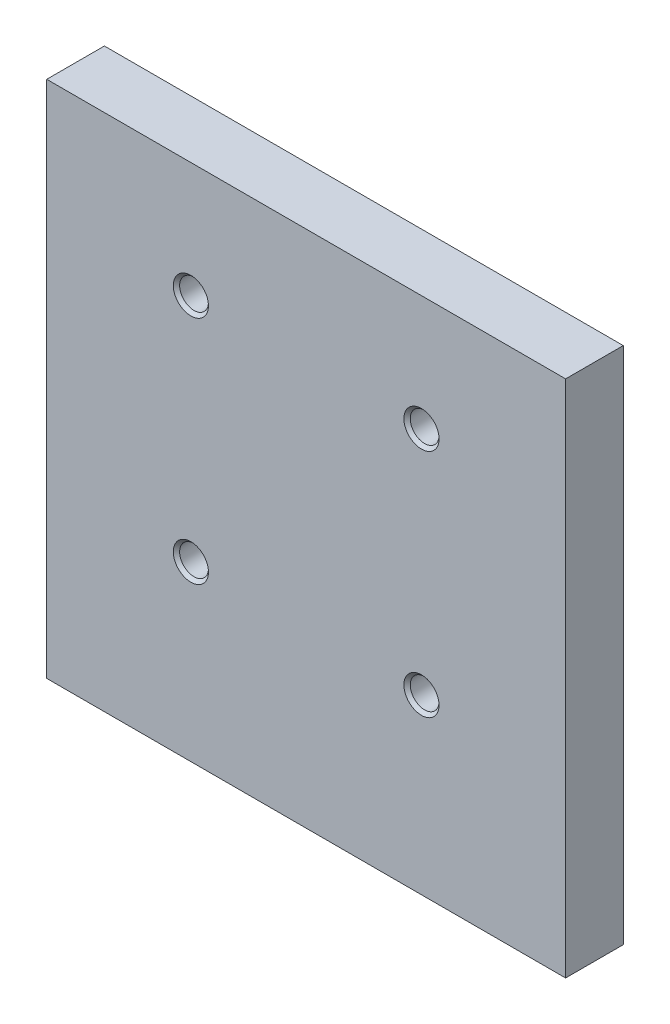
ISO-10303-21;
HEADER;
FILE_DESCRIPTION(('STEP AP214'),'2;1');
FILE_NAME('part.step','',(''),(''),'','','');
FILE_SCHEMA(('AUTOMOTIVE_DESIGN { 1 0 10303 214 1 1 1 1 }'));
ENDSEC;
DATA;
#1=APPLICATION_CONTEXT('core data for automotive mechanical design processes');
#2=APPLICATION_PROTOCOL_DEFINITION('international standard','automotive_design',2000,#1);
#3=PRODUCT_CONTEXT('',#1,'mechanical');
#4=PRODUCT('Part','Part','',(#3));
#5=PRODUCT_RELATED_PRODUCT_CATEGORY('part','',(#4));
#6=PRODUCT_DEFINITION_FORMATION('','',#4);
#7=PRODUCT_DEFINITION_CONTEXT('part definition',#1,'design');
#8=PRODUCT_DEFINITION('design','',#6,#7);
#9=PRODUCT_DEFINITION_SHAPE('','',#8);
#10=(LENGTH_UNIT() NAMED_UNIT(*) SI_UNIT(.MILLI.,.METRE.));
#11=(NAMED_UNIT(*) PLANE_ANGLE_UNIT() SI_UNIT($,.RADIAN.));
#12=(NAMED_UNIT(*) SI_UNIT($,.STERADIAN.) SOLID_ANGLE_UNIT());
#13=UNCERTAINTY_MEASURE_WITH_UNIT(LENGTH_MEASURE(1.E-05),#10,'distance_accuracy_value','');
#14=(GEOMETRIC_REPRESENTATION_CONTEXT(3) GLOBAL_UNCERTAINTY_ASSIGNED_CONTEXT((#13)) GLOBAL_UNIT_ASSIGNED_CONTEXT((#10,
#11,#12)) REPRESENTATION_CONTEXT('',''));
#15=CARTESIAN_POINT('',(0.,0.,0.));
#16=DIRECTION('',(0.,0.,1.));
#17=DIRECTION('',(1.,0.,0.));
#18=AXIS2_PLACEMENT_3D('',#15,#16,#17);
#19=CARTESIAN_POINT('',(0.,0.,5.));
#20=DIRECTION('',(1.,0.,0.));
#21=DIRECTION('',(0.,0.,-1.));
#22=AXIS2_PLACEMENT_3D('',#19,#20,#21);
#23=PLANE('',#22);
#24=DIRECTION('',(0.,-1.,0.));
#25=VECTOR('',#24,1.);
#26=CARTESIAN_POINT('',(0.,0.,0.));
#27=LINE('',#26,#25);
#28=CARTESIAN_POINT('',(0.,45.,0.));
#29=VERTEX_POINT('',#28);
#30=CARTESIAN_POINT('',(0.,0.,0.));
#31=VERTEX_POINT('',#30);
#32=EDGE_CURVE('E120',#29,#31,#27,.T.);
#33=ORIENTED_EDGE('',*,*,#32,.T.);
#34=DIRECTION('',(0.,0.,-1.));
#35=VECTOR('',#34,1.);
#36=CARTESIAN_POINT('',(0.,0.,5.));
#37=LINE('',#36,#35);
#38=CARTESIAN_POINT('',(0.,0.,5.));
#39=VERTEX_POINT('',#38);
#40=EDGE_CURVE('E11',#39,#31,#37,.T.);
#41=ORIENTED_EDGE('',*,*,#40,.F.);
#42=DIRECTION('',(0.,-1.,0.));
#43=VECTOR('',#42,1.);
#44=CARTESIAN_POINT('',(0.,0.,5.));
#45=LINE('',#44,#43);
#46=CARTESIAN_POINT('',(0.,45.,5.));
#47=VERTEX_POINT('',#46);
#48=EDGE_CURVE('E103',#47,#39,#45,.T.);
#49=ORIENTED_EDGE('',*,*,#48,.F.);
#50=DIRECTION('',(0.,0.,-1.));
#51=VECTOR('',#50,1.);
#52=CARTESIAN_POINT('',(0.,45.,5.));
#53=LINE('',#52,#51);
#54=EDGE_CURVE('E116',#47,#29,#53,.T.);
#55=ORIENTED_EDGE('',*,*,#54,.T.);
#56=EDGE_LOOP('',(#33,#41,#49,#55));
#57=FACE_BOUND('',#56,.T.);
#58=ADVANCED_FACE('F51',(#57),#23,.F.);
#59=CARTESIAN_POINT('',(0.,0.,5.));
#60=DIRECTION('',(0.,1.,0.));
#61=DIRECTION('',(0.,0.,1.));
#62=AXIS2_PLACEMENT_3D('',#59,#60,#61);
#63=PLANE('',#62);
#64=DIRECTION('',(1.,0.,0.));
#65=VECTOR('',#64,1.);
#66=CARTESIAN_POINT('',(0.,0.,0.));
#67=LINE('',#66,#65);
#68=CARTESIAN_POINT('',(45.,0.,0.));
#69=VERTEX_POINT('',#68);
#70=EDGE_CURVE('E108',#31,#69,#67,.T.);
#71=ORIENTED_EDGE('',*,*,#70,.T.);
#72=DIRECTION('',(0.,0.,-1.));
#73=VECTOR('',#72,1.);
#74=CARTESIAN_POINT('',(45.,0.,5.));
#75=LINE('',#74,#73);
#76=CARTESIAN_POINT('',(45.,0.,5.));
#77=VERTEX_POINT('',#76);
#78=EDGE_CURVE('E60',#77,#69,#75,.T.);
#79=ORIENTED_EDGE('',*,*,#78,.F.);
#80=DIRECTION('',(1.,0.,0.));
#81=VECTOR('',#80,1.);
#82=CARTESIAN_POINT('',(0.,0.,5.));
#83=LINE('',#82,#81);
#84=EDGE_CURVE('E98',#39,#77,#83,.T.);
#85=ORIENTED_EDGE('',*,*,#84,.F.);
#86=ORIENTED_EDGE('',*,*,#40,.T.);
#87=EDGE_LOOP('',(#71,#79,#85,#86));
#88=FACE_BOUND('',#87,.T.);
#89=ADVANCED_FACE('F107',(#88),#63,.F.);
#90=CARTESIAN_POINT('',(45.,0.,5.));
#91=DIRECTION('',(-1.,0.,0.));
#92=DIRECTION('',(0.,0.,1.));
#93=AXIS2_PLACEMENT_3D('',#90,#91,#92);
#94=PLANE('',#93);
#95=DIRECTION('',(0.,1.,0.));
#96=VECTOR('',#95,1.);
#97=CARTESIAN_POINT('',(45.,0.,0.));
#98=LINE('',#97,#96);
#99=CARTESIAN_POINT('',(45.,45.,0.));
#100=VERTEX_POINT('',#99);
#101=EDGE_CURVE('E85',#69,#100,#98,.T.);
#102=ORIENTED_EDGE('',*,*,#101,.T.);
#103=DIRECTION('',(0.,0.,-1.));
#104=VECTOR('',#103,1.);
#105=CARTESIAN_POINT('',(45.,45.,5.));
#106=LINE('',#105,#104);
#107=CARTESIAN_POINT('',(45.,45.,5.));
#108=VERTEX_POINT('',#107);
#109=EDGE_CURVE('E110',#108,#100,#106,.T.);
#110=ORIENTED_EDGE('',*,*,#109,.F.);
#111=DIRECTION('',(0.,1.,0.));
#112=VECTOR('',#111,1.);
#113=CARTESIAN_POINT('',(45.,0.,5.));
#114=LINE('',#113,#112);
#115=EDGE_CURVE('E101',#77,#108,#114,.T.);
#116=ORIENTED_EDGE('',*,*,#115,.F.);
#117=ORIENTED_EDGE('',*,*,#78,.T.);
#118=EDGE_LOOP('',(#102,#110,#116,#117));
#119=FACE_BOUND('',#118,.T.);
#120=ADVANCED_FACE('F111',(#119),#94,.F.);
#121=CARTESIAN_POINT('',(0.,45.,5.));
#122=DIRECTION('',(0.,-1.,0.));
#123=DIRECTION('',(0.,0.,-1.));
#124=AXIS2_PLACEMENT_3D('',#121,#122,#123);
#125=PLANE('',#124);
#126=DIRECTION('',(-1.,0.,0.));
#127=VECTOR('',#126,1.);
#128=CARTESIAN_POINT('',(0.,45.,0.));
#129=LINE('',#128,#127);
#130=EDGE_CURVE('E91',#100,#29,#129,.T.);
#131=ORIENTED_EDGE('',*,*,#130,.T.);
#132=ORIENTED_EDGE('',*,*,#54,.F.);
#133=DIRECTION('',(-1.,0.,0.));
#134=VECTOR('',#133,1.);
#135=CARTESIAN_POINT('',(0.,45.,5.));
#136=LINE('',#135,#134);
#137=EDGE_CURVE('E68',#108,#47,#136,.T.);
#138=ORIENTED_EDGE('',*,*,#137,.F.);
#139=ORIENTED_EDGE('',*,*,#109,.T.);
#140=EDGE_LOOP('',(#131,#132,#138,#139));
#141=FACE_BOUND('',#140,.T.);
#142=ADVANCED_FACE('F135',(#141),#125,.F.);
#143=CARTESIAN_POINT('',(0.,0.,5.));
#144=DIRECTION('',(0.,0.,-1.));
#145=DIRECTION('',(-1.,0.,0.));
#146=AXIS2_PLACEMENT_3D('',#143,#144,#145);
#147=PLANE('',#146);
#148=CARTESIAN_POINT('',(12.5,35.,5.));
#149=DIRECTION('',(0.,0.,1.));
#150=DIRECTION('',(1.,0.,0.));
#151=AXIS2_PLACEMENT_3D('',#148,#149,#150);
#152=CIRCLE('',#151,1.525);
#153=CARTESIAN_POINT('',(14.025,35.,5.));
#154=VERTEX_POINT('',#153);
#155=EDGE_CURVE('E184',#154,#154,#152,.T.);
#156=ORIENTED_EDGE('',*,*,#155,.F.);
#157=EDGE_LOOP('',(#156));
#158=FACE_BOUND('',#157,.T.);
#159=CARTESIAN_POINT('',(32.5,35.,5.));
#160=DIRECTION('',(0.,0.,1.));
#161=DIRECTION('',(1.,0.,0.));
#162=AXIS2_PLACEMENT_3D('',#159,#160,#161);
#163=CIRCLE('',#162,1.525);
#164=CARTESIAN_POINT('',(34.025,35.,5.));
#165=VERTEX_POINT('',#164);
#166=EDGE_CURVE('E172',#165,#165,#163,.T.);
#167=ORIENTED_EDGE('',*,*,#166,.F.);
#168=EDGE_LOOP('',(#167));
#169=FACE_BOUND('',#168,.T.);
#170=CARTESIAN_POINT('',(32.5,15.,5.));
#171=DIRECTION('',(0.,0.,1.));
#172=DIRECTION('',(1.,0.,0.));
#173=AXIS2_PLACEMENT_3D('',#170,#171,#172);
#174=CIRCLE('',#173,1.525);
#175=CARTESIAN_POINT('',(34.025,15.,5.));
#176=VERTEX_POINT('',#175);
#177=EDGE_CURVE('E161',#176,#176,#174,.T.);
#178=ORIENTED_EDGE('',*,*,#177,.F.);
#179=EDGE_LOOP('',(#178));
#180=FACE_BOUND('',#179,.T.);
#181=CARTESIAN_POINT('',(12.5,15.,5.));
#182=DIRECTION('',(0.,0.,1.));
#183=DIRECTION('',(1.,0.,0.));
#184=AXIS2_PLACEMENT_3D('',#181,#182,#183);
#185=CIRCLE('',#184,1.525);
#186=CARTESIAN_POINT('',(14.025,15.,5.));
#187=VERTEX_POINT('',#186);
#188=EDGE_CURVE('E149',#187,#187,#185,.T.);
#189=ORIENTED_EDGE('',*,*,#188,.F.);
#190=EDGE_LOOP('',(#189));
#191=FACE_BOUND('',#190,.T.);
#192=ORIENTED_EDGE('',*,*,#48,.T.);
#193=ORIENTED_EDGE('',*,*,#84,.T.);
#194=ORIENTED_EDGE('',*,*,#115,.T.);
#195=ORIENTED_EDGE('',*,*,#137,.T.);
#196=EDGE_LOOP('',(#192,#193,#194,#195));
#197=FACE_BOUND('',#196,.T.);
#198=ADVANCED_FACE('F99',(#158,#169,#180,#191,#197),#147,.F.);
#199=CARTESIAN_POINT('',(0.,0.,0.));
#200=DIRECTION('',(0.,0.,-1.));
#201=DIRECTION('',(-1.,0.,0.));
#202=AXIS2_PLACEMENT_3D('',#199,#200,#201);
#203=PLANE('',#202);
#204=CARTESIAN_POINT('',(12.5,35.,0.));
#205=DIRECTION('',(0.,0.,1.));
#206=DIRECTION('',(1.,0.,0.));
#207=AXIS2_PLACEMENT_3D('',#204,#205,#206);
#208=CIRCLE('',#207,1.25);
#209=CARTESIAN_POINT('',(13.75,35.,0.));
#210=VERTEX_POINT('',#209);
#211=EDGE_CURVE('E176',#210,#210,#208,.T.);
#212=ORIENTED_EDGE('',*,*,#211,.T.);
#213=EDGE_LOOP('',(#212));
#214=FACE_BOUND('',#213,.T.);
#215=CARTESIAN_POINT('',(32.5,35.,0.));
#216=DIRECTION('',(0.,0.,1.));
#217=DIRECTION('',(1.,0.,0.));
#218=AXIS2_PLACEMENT_3D('',#215,#216,#217);
#219=CIRCLE('',#218,1.25);
#220=CARTESIAN_POINT('',(33.75,35.,0.));
#221=VERTEX_POINT('',#220);
#222=EDGE_CURVE('E165',#221,#221,#219,.T.);
#223=ORIENTED_EDGE('',*,*,#222,.T.);
#224=EDGE_LOOP('',(#223));
#225=FACE_BOUND('',#224,.T.);
#226=CARTESIAN_POINT('',(32.5,15.,0.));
#227=DIRECTION('',(0.,0.,1.));
#228=DIRECTION('',(1.,0.,0.));
#229=AXIS2_PLACEMENT_3D('',#226,#227,#228);
#230=CIRCLE('',#229,1.25);
#231=CARTESIAN_POINT('',(33.75,15.,0.));
#232=VERTEX_POINT('',#231);
#233=EDGE_CURVE('E153',#232,#232,#230,.T.);
#234=ORIENTED_EDGE('',*,*,#233,.T.);
#235=EDGE_LOOP('',(#234));
#236=FACE_BOUND('',#235,.T.);
#237=CARTESIAN_POINT('',(12.5,15.,0.));
#238=DIRECTION('',(0.,0.,1.));
#239=DIRECTION('',(1.,0.,0.));
#240=AXIS2_PLACEMENT_3D('',#237,#238,#239);
#241=CIRCLE('',#240,1.25);
#242=CARTESIAN_POINT('',(13.75,15.,0.));
#243=VERTEX_POINT('',#242);
#244=EDGE_CURVE('E124',#243,#243,#241,.T.);
#245=ORIENTED_EDGE('',*,*,#244,.T.);
#246=EDGE_LOOP('',(#245));
#247=FACE_BOUND('',#246,.T.);
#248=ORIENTED_EDGE('',*,*,#32,.F.);
#249=ORIENTED_EDGE('',*,*,#130,.F.);
#250=ORIENTED_EDGE('',*,*,#101,.F.);
#251=ORIENTED_EDGE('',*,*,#70,.F.);
#252=EDGE_LOOP('',(#248,#249,#250,#251));
#253=FACE_BOUND('',#252,.T.);
#254=ADVANCED_FACE('F138',(#214,#225,#236,#247,#253),#203,.T.);
#255=CARTESIAN_POINT('',(12.5,15.,5.));
#256=DIRECTION('',(0.,0.,1.));
#257=DIRECTION('',(1.,0.,0.));
#258=AXIS2_PLACEMENT_3D('',#255,#256,#257);
#259=CYLINDRICAL_SURFACE('',#258,1.25);
#260=ORIENTED_EDGE('',*,*,#244,.F.);
#261=EDGE_LOOP('',(#260));
#262=FACE_BOUND('',#261,.T.);
#263=CARTESIAN_POINT('',(12.5,15.,4.725));
#264=DIRECTION('',(0.,0.,1.));
#265=DIRECTION('',(1.,0.,0.));
#266=AXIS2_PLACEMENT_3D('',#263,#264,#265);
#267=CIRCLE('',#266,1.25);
#268=CARTESIAN_POINT('',(13.75,15.,4.725));
#269=VERTEX_POINT('',#268);
#270=EDGE_CURVE('E146',#269,#269,#267,.T.);
#271=ORIENTED_EDGE('',*,*,#270,.T.);
#272=EDGE_LOOP('',(#271));
#273=FACE_BOUND('',#272,.T.);
#274=ADVANCED_FACE('F202',(#262,#273),#259,.F.);
#275=CARTESIAN_POINT('',(12.5,15.,5.));
#276=DIRECTION('',(0.,0.,1.));
#277=DIRECTION('',(1.,0.,0.));
#278=AXIS2_PLACEMENT_3D('',#275,#276,#277);
#279=CONICAL_SURFACE('',#278,1.525,0.785398163397448);
#280=ORIENTED_EDGE('',*,*,#270,.F.);
#281=EDGE_LOOP('',(#280));
#282=FACE_BOUND('',#281,.T.);
#283=ORIENTED_EDGE('',*,*,#188,.T.);
#284=EDGE_LOOP('',(#283));
#285=FACE_BOUND('',#284,.T.);
#286=ADVANCED_FACE('F199',(#282,#285),#279,.F.);
#287=CARTESIAN_POINT('',(32.5,15.,5.));
#288=DIRECTION('',(0.,0.,1.));
#289=DIRECTION('',(1.,0.,0.));
#290=AXIS2_PLACEMENT_3D('',#287,#288,#289);
#291=CYLINDRICAL_SURFACE('',#290,1.25);
#292=ORIENTED_EDGE('',*,*,#233,.F.);
#293=EDGE_LOOP('',(#292));
#294=FACE_BOUND('',#293,.T.);
#295=CARTESIAN_POINT('',(32.5,15.,4.725));
#296=DIRECTION('',(0.,0.,1.));
#297=DIRECTION('',(1.,0.,0.));
#298=AXIS2_PLACEMENT_3D('',#295,#296,#297);
#299=CIRCLE('',#298,1.25);
#300=CARTESIAN_POINT('',(33.75,15.,4.725));
#301=VERTEX_POINT('',#300);
#302=EDGE_CURVE('E157',#301,#301,#299,.T.);
#303=ORIENTED_EDGE('',*,*,#302,.T.);
#304=EDGE_LOOP('',(#303));
#305=FACE_BOUND('',#304,.T.);
#306=ADVANCED_FACE('F201',(#294,#305),#291,.F.);
#307=CARTESIAN_POINT('',(32.5,15.,5.));
#308=DIRECTION('',(0.,0.,1.));
#309=DIRECTION('',(1.,0.,0.));
#310=AXIS2_PLACEMENT_3D('',#307,#308,#309);
#311=CONICAL_SURFACE('',#310,1.525,0.785398163397442);
#312=ORIENTED_EDGE('',*,*,#302,.F.);
#313=EDGE_LOOP('',(#312));
#314=FACE_BOUND('',#313,.T.);
#315=ORIENTED_EDGE('',*,*,#177,.T.);
#316=EDGE_LOOP('',(#315));
#317=FACE_BOUND('',#316,.T.);
#318=ADVANCED_FACE('F209',(#314,#317),#311,.F.);
#319=CARTESIAN_POINT('',(32.5,35.,5.));
#320=DIRECTION('',(0.,0.,1.));
#321=DIRECTION('',(1.,0.,0.));
#322=AXIS2_PLACEMENT_3D('',#319,#320,#321);
#323=CYLINDRICAL_SURFACE('',#322,1.25);
#324=ORIENTED_EDGE('',*,*,#222,.F.);
#325=EDGE_LOOP('',(#324));
#326=FACE_BOUND('',#325,.T.);
#327=CARTESIAN_POINT('',(32.5,35.,4.725));
#328=DIRECTION('',(0.,0.,1.));
#329=DIRECTION('',(1.,0.,0.));
#330=AXIS2_PLACEMENT_3D('',#327,#328,#329);
#331=CIRCLE('',#330,1.25);
#332=CARTESIAN_POINT('',(33.75,35.,4.725));
#333=VERTEX_POINT('',#332);
#334=EDGE_CURVE('E168',#333,#333,#331,.T.);
#335=ORIENTED_EDGE('',*,*,#334,.T.);
#336=EDGE_LOOP('',(#335));
#337=FACE_BOUND('',#336,.T.);
#338=ADVANCED_FACE('F241',(#326,#337),#323,.F.);
#339=CARTESIAN_POINT('',(32.5,35.,5.));
#340=DIRECTION('',(0.,0.,1.));
#341=DIRECTION('',(1.,0.,0.));
#342=AXIS2_PLACEMENT_3D('',#339,#340,#341);
#343=CONICAL_SURFACE('',#342,1.525,0.785398163397442);
#344=ORIENTED_EDGE('',*,*,#334,.F.);
#345=EDGE_LOOP('',(#344));
#346=FACE_BOUND('',#345,.T.);
#347=ORIENTED_EDGE('',*,*,#166,.T.);
#348=EDGE_LOOP('',(#347));
#349=FACE_BOUND('',#348,.T.);
#350=ADVANCED_FACE('F246',(#346,#349),#343,.F.);
#351=CARTESIAN_POINT('',(12.5,35.,5.));
#352=DIRECTION('',(0.,0.,1.));
#353=DIRECTION('',(1.,0.,0.));
#354=AXIS2_PLACEMENT_3D('',#351,#352,#353);
#355=CYLINDRICAL_SURFACE('',#354,1.25);
#356=ORIENTED_EDGE('',*,*,#211,.F.);
#357=EDGE_LOOP('',(#356));
#358=FACE_BOUND('',#357,.T.);
#359=CARTESIAN_POINT('',(12.5,35.,4.725));
#360=DIRECTION('',(0.,0.,1.));
#361=DIRECTION('',(1.,0.,0.));
#362=AXIS2_PLACEMENT_3D('',#359,#360,#361);
#363=CIRCLE('',#362,1.25);
#364=CARTESIAN_POINT('',(13.75,35.,4.725));
#365=VERTEX_POINT('',#364);
#366=EDGE_CURVE('E180',#365,#365,#363,.T.);
#367=ORIENTED_EDGE('',*,*,#366,.T.);
#368=EDGE_LOOP('',(#367));
#369=FACE_BOUND('',#368,.T.);
#370=ADVANCED_FACE('F252',(#358,#369),#355,.F.);
#371=CARTESIAN_POINT('',(12.5,35.,5.));
#372=DIRECTION('',(0.,0.,1.));
#373=DIRECTION('',(1.,0.,0.));
#374=AXIS2_PLACEMENT_3D('',#371,#372,#373);
#375=CONICAL_SURFACE('',#374,1.525,0.785398163397448);
#376=ORIENTED_EDGE('',*,*,#366,.F.);
#377=EDGE_LOOP('',(#376));
#378=FACE_BOUND('',#377,.T.);
#379=ORIENTED_EDGE('',*,*,#155,.T.);
#380=EDGE_LOOP('',(#379));
#381=FACE_BOUND('',#380,.T.);
#382=ADVANCED_FACE('F188',(#378,#381),#375,.F.);
#383=CLOSED_SHELL('',(#58,#89,#120,#142,#198,#254,#274,#286,#306,#318,#338,#350,#370,#382));
#384=MANIFOLD_SOLID_BREP('B2',#383);
#385=ADVANCED_BREP_SHAPE_REPRESENTATION('',(#18,#384),#14);
#386=SHAPE_DEFINITION_REPRESENTATION(#9,#385);
ENDSEC;
END-ISO-10303-21;
